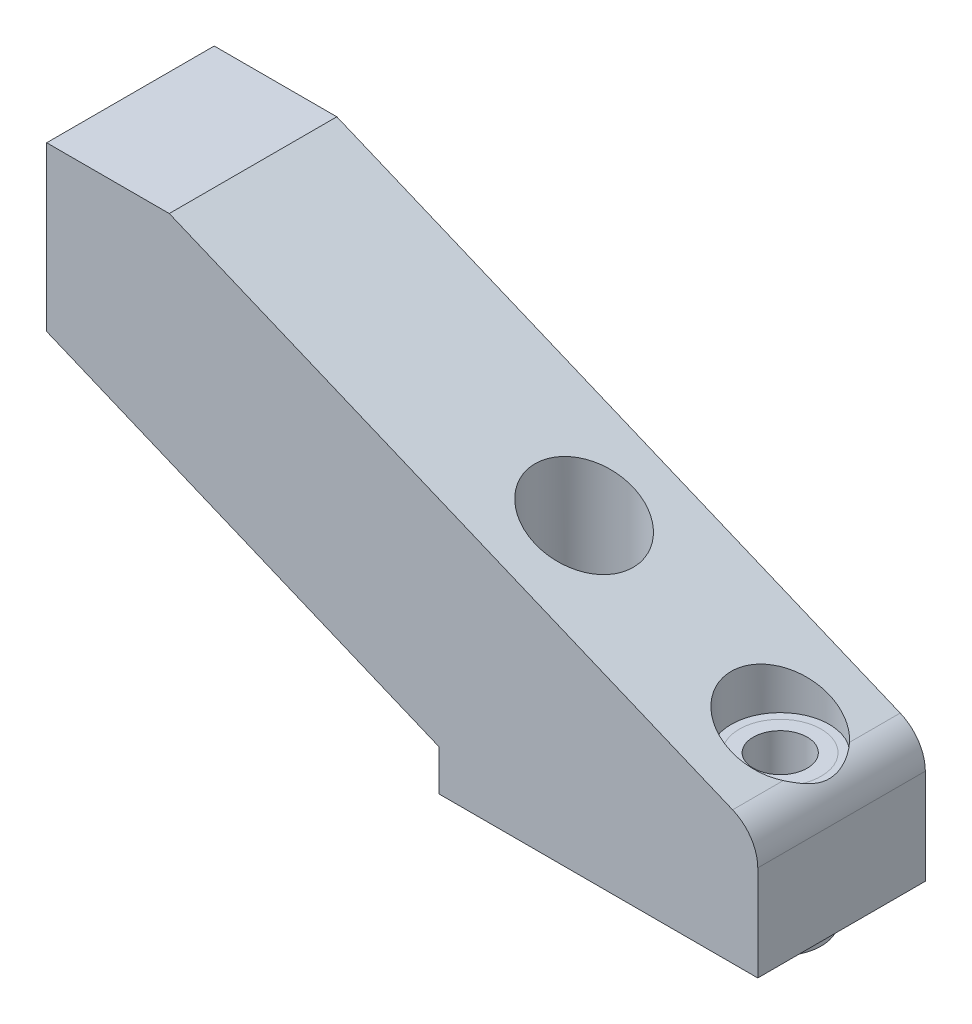
ISO-10303-21;
HEADER;
FILE_DESCRIPTION(('STEP AP214'),'2;1');
FILE_NAME('part.step','',(''),(''),'','','');
FILE_SCHEMA(('AUTOMOTIVE_DESIGN { 1 0 10303 214 1 1 1 1 }'));
ENDSEC;
DATA;
#1=APPLICATION_CONTEXT('core data for automotive mechanical design processes');
#2=APPLICATION_PROTOCOL_DEFINITION('international standard','automotive_design',2000,#1);
#3=PRODUCT_CONTEXT('',#1,'mechanical');
#4=PRODUCT('Part','Part','',(#3));
#5=PRODUCT_RELATED_PRODUCT_CATEGORY('part','',(#4));
#6=PRODUCT_DEFINITION_FORMATION('','',#4);
#7=PRODUCT_DEFINITION_CONTEXT('part definition',#1,'design');
#8=PRODUCT_DEFINITION('design','',#6,#7);
#9=PRODUCT_DEFINITION_SHAPE('','',#8);
#10=(LENGTH_UNIT() NAMED_UNIT(*) SI_UNIT(.MILLI.,.METRE.));
#11=(NAMED_UNIT(*) PLANE_ANGLE_UNIT() SI_UNIT($,.RADIAN.));
#12=(NAMED_UNIT(*) SI_UNIT($,.STERADIAN.) SOLID_ANGLE_UNIT());
#13=UNCERTAINTY_MEASURE_WITH_UNIT(LENGTH_MEASURE(1.E-05),#10,'distance_accuracy_value','');
#14=(GEOMETRIC_REPRESENTATION_CONTEXT(3) GLOBAL_UNCERTAINTY_ASSIGNED_CONTEXT((#13)) GLOBAL_UNIT_ASSIGNED_CONTEXT((#10,
#11,#12)) REPRESENTATION_CONTEXT('',''));
#15=CARTESIAN_POINT('',(0.,0.,0.));
#16=DIRECTION('',(0.,0.,1.));
#17=DIRECTION('',(1.,0.,0.));
#18=AXIS2_PLACEMENT_3D('',#15,#16,#17);
#19=CARTESIAN_POINT('',(-31.5,10.,10.25));
#20=DIRECTION('',(0.,1.,0.));
#21=DIRECTION('',(0.,0.,1.));
#22=AXIS2_PLACEMENT_3D('',#19,#20,#21);
#23=PLANE('',#22);
#24=CARTESIAN_POINT('',(-31.5,10.,10.25));
#25=DIRECTION('',(0.,1.,0.));
#26=DIRECTION('',(0.,0.,1.));
#27=AXIS2_PLACEMENT_3D('',#24,#25,#26);
#28=CIRCLE('',#27,6.);
#29=CARTESIAN_POINT('',(-31.5,10.,16.25));
#30=VERTEX_POINT('',#29);
#31=EDGE_CURVE('E277',#30,#30,#28,.T.);
#32=ORIENTED_EDGE('',*,*,#31,.T.);
#33=EDGE_LOOP('',(#32));
#34=FACE_BOUND('',#33,.T.);
#35=CARTESIAN_POINT('',(-31.5,10.,10.25));
#36=DIRECTION('',(0.,1.,0.));
#37=DIRECTION('',(0.,0.,1.));
#38=AXIS2_PLACEMENT_3D('',#35,#36,#37);
#39=CIRCLE('',#38,5.);
#40=CARTESIAN_POINT('',(-31.5,10.,15.25));
#41=VERTEX_POINT('',#40);
#42=EDGE_CURVE('E13',#41,#41,#39,.F.);
#43=ORIENTED_EDGE('',*,*,#42,.T.);
#44=EDGE_LOOP('',(#43));
#45=FACE_BOUND('',#44,.T.);
#46=ADVANCED_FACE('F54',(#34,#45),#23,.T.);
#47=CARTESIAN_POINT('',(-7.50000000000002,10.,10.25));
#48=DIRECTION('',(0.,1.,0.));
#49=DIRECTION('',(0.,0.,1.));
#50=AXIS2_PLACEMENT_3D('',#47,#48,#49);
#51=PLANE('',#50);
#52=CARTESIAN_POINT('',(-7.50000000000002,10.,10.25));
#53=DIRECTION('',(0.,1.,0.));
#54=DIRECTION('',(0.,0.,1.));
#55=AXIS2_PLACEMENT_3D('',#52,#53,#54);
#56=CIRCLE('',#55,6.);
#57=CARTESIAN_POINT('',(-7.50000000000002,10.,16.25));
#58=VERTEX_POINT('',#57);
#59=EDGE_CURVE('E204',#58,#58,#56,.T.);
#60=ORIENTED_EDGE('',*,*,#59,.T.);
#61=EDGE_LOOP('',(#60));
#62=FACE_BOUND('',#61,.T.);
#63=CARTESIAN_POINT('',(-7.5,10.,10.25));
#64=DIRECTION('',(0.,1.,0.));
#65=DIRECTION('',(0.,0.,1.));
#66=AXIS2_PLACEMENT_3D('',#63,#64,#65);
#67=CIRCLE('',#66,5.);
#68=CARTESIAN_POINT('',(-7.5,10.,15.25));
#69=VERTEX_POINT('',#68);
#70=EDGE_CURVE('E63',#69,#69,#67,.F.);
#71=ORIENTED_EDGE('',*,*,#70,.T.);
#72=EDGE_LOOP('',(#71));
#73=FACE_BOUND('',#72,.T.);
#74=ADVANCED_FACE('F222',(#62,#73),#51,.T.);
#75=CARTESIAN_POINT('',(-31.5,-10.,10.25));
#76=DIRECTION('',(0.,1.,0.));
#77=DIRECTION('',(0.,0.,1.));
#78=AXIS2_PLACEMENT_3D('',#75,#76,#77);
#79=CYLINDRICAL_SURFACE('',#78,3.3);
#80=CARTESIAN_POINT('',(-31.5,-5.,10.25));
#81=DIRECTION('',(0.,1.,0.));
#82=DIRECTION('',(0.,0.,1.));
#83=AXIS2_PLACEMENT_3D('',#80,#81,#82);
#84=CIRCLE('',#83,3.3);
#85=CARTESIAN_POINT('',(-31.5,-5.,13.55));
#86=VERTEX_POINT('',#85);
#87=EDGE_CURVE('E195',#86,#86,#84,.T.);
#88=ORIENTED_EDGE('',*,*,#87,.F.);
#89=EDGE_LOOP('',(#88));
#90=FACE_BOUND('',#89,.T.);
#91=CARTESIAN_POINT('',(-31.5,10.,10.25));
#92=DIRECTION('',(0.,1.,0.));
#93=DIRECTION('',(0.,0.,1.));
#94=AXIS2_PLACEMENT_3D('',#91,#92,#93);
#95=CIRCLE('',#94,3.3);
#96=CARTESIAN_POINT('',(-31.5,10.,13.55));
#97=VERTEX_POINT('',#96);
#98=EDGE_CURVE('E203',#97,#97,#95,.F.);
#99=ORIENTED_EDGE('',*,*,#98,.F.);
#100=EDGE_LOOP('',(#99));
#101=FACE_BOUND('',#100,.T.);
#102=ADVANCED_FACE('F234',(#90,#101),#79,.F.);
#103=CARTESIAN_POINT('',(-7.5,-10.,10.25));
#104=DIRECTION('',(0.,1.,0.));
#105=DIRECTION('',(0.,0.,1.));
#106=AXIS2_PLACEMENT_3D('',#103,#104,#105);
#107=CYLINDRICAL_SURFACE('',#106,3.3);
#108=CARTESIAN_POINT('',(-7.5,-5.,10.25));
#109=DIRECTION('',(0.,1.,0.));
#110=DIRECTION('',(0.,0.,1.));
#111=AXIS2_PLACEMENT_3D('',#108,#109,#110);
#112=CIRCLE('',#111,3.3);
#113=CARTESIAN_POINT('',(-7.5,-5.,13.55));
#114=VERTEX_POINT('',#113);
#115=EDGE_CURVE('E163',#114,#114,#112,.T.);
#116=ORIENTED_EDGE('',*,*,#115,.F.);
#117=EDGE_LOOP('',(#116));
#118=FACE_BOUND('',#117,.T.);
#119=CARTESIAN_POINT('',(-7.5,10.,10.25));
#120=DIRECTION('',(0.,1.,0.));
#121=DIRECTION('',(0.,0.,1.));
#122=AXIS2_PLACEMENT_3D('',#119,#120,#121);
#123=CIRCLE('',#122,3.3);
#124=CARTESIAN_POINT('',(-7.5,10.,13.55));
#125=VERTEX_POINT('',#124);
#126=EDGE_CURVE('E200',#125,#125,#123,.F.);
#127=ORIENTED_EDGE('',*,*,#126,.F.);
#128=EDGE_LOOP('',(#127));
#129=FACE_BOUND('',#128,.T.);
#130=ADVANCED_FACE('F232',(#118,#129),#107,.F.);
#131=CARTESIAN_POINT('',(0.,0.,20.5));
#132=DIRECTION('',(-1.,0.,0.));
#133=DIRECTION('',(0.,0.,1.));
#134=AXIS2_PLACEMENT_3D('',#131,#132,#133);
#135=PLANE('',#134);
#136=DIRECTION('',(0.,1.,0.));
#137=VECTOR('',#136,1.);
#138=CARTESIAN_POINT('',(0.,0.,0.));
#139=LINE('',#138,#137);
#140=CARTESIAN_POINT('',(0.,-5.,0.));
#141=VERTEX_POINT('',#140);
#142=CARTESIAN_POINT('',(0.,6.66666666666667,0.));
#143=VERTEX_POINT('',#142);
#144=EDGE_CURVE('E111',#141,#143,#139,.T.);
#145=ORIENTED_EDGE('',*,*,#144,.T.);
#146=DIRECTION('',(0.,0.,-1.));
#147=VECTOR('',#146,1.);
#148=CARTESIAN_POINT('',(0.,6.66666666666667,20.5));
#149=LINE('',#148,#147);
#150=CARTESIAN_POINT('',(0.,6.66666666666667,20.5));
#151=VERTEX_POINT('',#150);
#152=EDGE_CURVE('E191',#151,#143,#149,.T.);
#153=ORIENTED_EDGE('',*,*,#152,.F.);
#154=DIRECTION('',(0.,1.,0.));
#155=VECTOR('',#154,1.);
#156=CARTESIAN_POINT('',(0.,-5.,20.5));
#157=LINE('',#156,#155);
#158=CARTESIAN_POINT('',(0.,-5.,20.5));
#159=VERTEX_POINT('',#158);
#160=EDGE_CURVE('E117',#159,#151,#157,.T.);
#161=ORIENTED_EDGE('',*,*,#160,.F.);
#162=DIRECTION('',(0.,0.,-1.));
#163=VECTOR('',#162,1.);
#164=CARTESIAN_POINT('',(0.,-5.,20.5));
#165=LINE('',#164,#163);
#166=EDGE_CURVE('E157',#159,#141,#165,.T.);
#167=ORIENTED_EDGE('',*,*,#166,.T.);
#168=EDGE_LOOP('',(#145,#153,#161,#167));
#169=FACE_BOUND('',#168,.T.);
#170=ADVANCED_FACE('F56',(#169),#135,.F.);
#171=CARTESIAN_POINT('',(-5.,6.66666666666667,20.5));
#172=DIRECTION('',(0.,0.,-1.));
#173=DIRECTION('',(-1.,0.,0.));
#174=AXIS2_PLACEMENT_3D('',#171,#172,#173);
#175=CYLINDRICAL_SURFACE('',#174,5.);
#176=DIRECTION('',(0.,0.,-1.));
#177=VECTOR('',#176,1.);
#178=CARTESIAN_POINT('',(-3.07692307692308,11.2820512820513,20.5));
#179=LINE('',#178,#177);
#180=CARTESIAN_POINT('',(-3.07692307692308,11.2820512820513,6.19581814264034));
#181=VERTEX_POINT('',#180);
#182=CARTESIAN_POINT('',(-3.07692307692308,11.2820512820513,0.));
#183=VERTEX_POINT('',#182);
#184=EDGE_CURVE('E187',#181,#183,#179,.T.);
#185=ORIENTED_EDGE('',*,*,#184,.F.);
#186=CARTESIAN_POINT('',(-8.72677996249961,10.,4.37675465150574));
#187=CARTESIAN_POINT('',(-8.64534208200483,10.0910622314345,4.35974020699521));
#188=CARTESIAN_POINT('',(-8.56044065317051,10.1792570936248,4.34377802659103));
#189=CARTESIAN_POINT('',(-8.38407997862645,10.3494659563773,4.3148183609117));
#190=CARTESIAN_POINT('',(-8.29261654289261,10.4314759379331,4.30182279244698));
#191=CARTESIAN_POINT('',(-8.10318455108689,10.589101940094,4.27963117656772));
#192=CARTESIAN_POINT('',(-8.00518873346695,10.6646877270472,4.27045238037427));
#193=CARTESIAN_POINT('',(-7.80365031732199,10.8085097872096,4.25683784311139));
#194=CARTESIAN_POINT('',(-7.70010885445373,10.8767475566203,4.25240113481079));
#195=CARTESIAN_POINT('',(-7.48765142971187,11.0056876927195,4.24906785878474));
#196=CARTESIAN_POINT('',(-7.37871195621509,11.0663521308694,4.25019811299138));
#197=CARTESIAN_POINT('',(-7.15680441468711,11.1792812002115,4.2587946331975));
#198=CARTESIAN_POINT('',(-7.04383672236937,11.2315466122929,4.2662603097629));
#199=CARTESIAN_POINT('',(-6.81519530149293,11.3271795014355,4.28810483136917));
#200=CARTESIAN_POINT('',(-6.69952962823199,11.3705704280777,4.30246511283874));
#201=CARTESIAN_POINT('',(-6.4663490765512,11.4483947781114,4.33852990884014));
#202=CARTESIAN_POINT('',(-6.34883437977868,11.4828290756436,4.36023370619036));
#203=CARTESIAN_POINT('',(-6.12279476020176,11.5402486844358,4.40914666375533));
#204=CARTESIAN_POINT('',(-6.01431930944292,11.5639392696264,4.43576157423551));
#205=CARTESIAN_POINT('',(-5.79773126930068,11.6038474141021,4.49544512274686));
#206=CARTESIAN_POINT('',(-5.68961880947288,11.6200625392498,4.5285158579224));
#207=CARTESIAN_POINT('',(-5.47465287224055,11.6452631165173,4.60103172043856));
#208=CARTESIAN_POINT('',(-5.36779994180698,11.6542455339974,4.64047951508665));
#209=CARTESIAN_POINT('',(-5.15617845757796,11.6653506959972,4.72555305927101));
#210=CARTESIAN_POINT('',(-5.05141075709718,11.667470687402,4.77118128066676));
#211=CARTESIAN_POINT('',(-4.8454332735961,11.66533060126,4.8679808216041));
#212=CARTESIAN_POINT('',(-4.74420375747059,11.6611149629025,4.91911121795795));
#213=CARTESIAN_POINT('',(-4.54510560431886,11.6469323425467,5.02683683751179));
#214=CARTESIAN_POINT('',(-4.44723802811781,11.6369635625491,5.08343376453167));
#215=CARTESIAN_POINT('',(-4.15942323709116,11.5992935137595,5.26088780372263));
#216=CARTESIAN_POINT('',(-3.9751345801595,11.5638257961835,5.38946923531912));
#217=CARTESIAN_POINT('',(-3.67271690195939,11.4890656838207,5.6263557386551));
#218=CARTESIAN_POINT('',(-3.55031600392748,11.4534974913457,5.73053408188319));
#219=CARTESIAN_POINT('',(-3.31529887985958,11.3759208216473,5.94723384358054));
#220=CARTESIAN_POINT('',(-3.20268336875502,11.333911874474,6.0597558705375));
#221=CARTESIAN_POINT('',(-2.98729291505787,11.2451620691773,6.29263820038802));
#222=CARTESIAN_POINT('',(-2.8845435668895,11.1984095182233,6.4130175977789));
#223=CARTESIAN_POINT('',(-2.68938591877344,11.1020805443862,6.66073202517334));
#224=CARTESIAN_POINT('',(-2.59697402864899,11.052505110967,6.78806461734076));
#225=CARTESIAN_POINT('',(-2.42086438929259,10.951357031881,7.05187082885497));
#226=CARTESIAN_POINT('',(-2.337373952219,10.8997642816631,7.18847503626284));
#227=CARTESIAN_POINT('',(-2.18141444607274,10.7975584933672,7.46822081618814));
#228=CARTESIAN_POINT('',(-2.10894686410207,10.7469455882834,7.61136326740391));
#229=CARTESIAN_POINT('',(-1.97546353568661,10.6490051675813,7.90366895436532));
#230=CARTESIAN_POINT('',(-1.91442858221183,10.6016722274259,8.05282157109221));
#231=CARTESIAN_POINT('',(-1.80411282261906,10.5126172118048,8.35710606237861));
#232=CARTESIAN_POINT('',(-1.7548331317351,10.4708956688619,8.51223850262976));
#233=CARTESIAN_POINT('',(-1.67880979591923,10.4045284884872,8.7907531377097));
#234=CARTESIAN_POINT('',(-1.64949168330156,10.3781742154156,8.91302734109111));
#235=CARTESIAN_POINT('',(-1.59844989111952,10.3314527008079,9.16022117274573));
#236=CARTESIAN_POINT('',(-1.57672157947953,10.3110818088107,9.2851391379733));
#237=CARTESIAN_POINT('',(-1.54118383330588,10.2773720666038,9.53681786946379));
#238=CARTESIAN_POINT('',(-1.5273602644863,10.264020668469,9.66357492835813));
#239=CARTESIAN_POINT('',(-1.50781458638908,10.2450503033721,9.91829700264618));
#240=CARTESIAN_POINT('',(-1.50209233598923,10.239431201716,10.046261996959));
#241=CARTESIAN_POINT('',(-1.49885729429702,10.2362612605154,10.3027732484166));
#242=CARTESIAN_POINT('',(-1.50136857369596,10.2387340776226,10.4313201107506));
#243=CARTESIAN_POINT('',(-1.5146018433274,10.2516468875179,10.6875780670445));
#244=CARTESIAN_POINT('',(-1.52532390534227,10.2620869499593,10.8152891536878));
#245=CARTESIAN_POINT('',(-1.5548061506279,10.2903460463166,11.069160394439));
#246=CARTESIAN_POINT('',(-1.57357937890581,10.3081770539305,11.1953176882503));
#247=CARTESIAN_POINT('',(-1.61886791807501,10.3502655759044,11.445172722967));
#248=CARTESIAN_POINT('',(-1.64538808088196,10.3745271168312,11.5688688704373));
#249=CARTESIAN_POINT('',(-1.75416868252659,10.471348662546,12.0084671749908));
#250=CARTESIAN_POINT('',(-1.85783734886878,10.5591929550256,12.3160446216262));
#251=CARTESIAN_POINT('',(-2.04718308141948,10.7024052653886,12.7585322279136));
#252=CARTESIAN_POINT('',(-2.11606817124928,10.7521339169147,12.9030850813188));
#253=CARTESIAN_POINT('',(-2.26490484059295,10.853232764608,13.1858563064587));
#254=CARTESIAN_POINT('',(-2.34485529409114,10.9046027933396,13.3240753208247));
#255=CARTESIAN_POINT('',(-2.51792889855564,11.0083005529025,13.5975191887942));
#256=CARTESIAN_POINT('',(-2.61135387263293,11.0606157641962,13.7325571308169));
#257=CARTESIAN_POINT('',(-2.8094988738899,11.1626787857137,13.9951629726261));
#258=CARTESIAN_POINT('',(-2.9142201979631,11.212426300178,14.1227300121055));
#259=CARTESIAN_POINT('',(-3.13453575183232,11.3071832380803,14.3694680640624));
#260=CARTESIAN_POINT('',(-3.25010532815848,11.3522029347097,14.4886570866803));
#261=CARTESIAN_POINT('',(-3.49205880459036,11.4355740873376,14.7181303111237));
#262=CARTESIAN_POINT('',(-3.61844242464034,11.4739257159439,14.8284147434113));
#263=CARTESIAN_POINT('',(-3.84757497540289,11.5330911683336,15.0118735232858));
#264=CARTESIAN_POINT('',(-3.94802693658163,11.5558778703609,15.0872898034483));
#265=CARTESIAN_POINT('',(-4.15422961232645,11.5957327964458,15.2321366200773));
#266=CARTESIAN_POINT('',(-4.25997901103005,11.6128024325825,15.301568631469));
#267=CARTESIAN_POINT('',(-4.47629770447335,11.6403597032782,15.4339465297516));
#268=CARTESIAN_POINT('',(-4.58686684573356,11.6508475472639,15.4968926229652));
#269=CARTESIAN_POINT('',(-4.8121124386083,11.6644081512859,15.6157680683279));
#270=CARTESIAN_POINT('',(-4.92678714357377,11.6674840274649,15.6717003598437));
#271=CARTESIAN_POINT('',(-5.16039133990522,11.6654693382084,15.7765499940617));
#272=CARTESIAN_POINT('',(-5.27934823219195,11.6603108278583,15.8254053063436));
#273=CARTESIAN_POINT('',(-5.5195288192643,11.6410612020782,15.9151714569376));
#274=CARTESIAN_POINT('',(-5.64075251918756,11.6269700664002,15.9560822772413));
#275=CARTESIAN_POINT('',(-5.88410565671303,11.5894198568775,16.0297084799398));
#276=CARTESIAN_POINT('',(-6.0062340770016,11.565970086041,16.0624319486226));
#277=CARTESIAN_POINT('',(-6.25017559080543,11.509468533753,16.1197216238231));
#278=CARTESIAN_POINT('',(-6.37198871738301,11.4764178039499,16.1442887231238));
#279=CARTESIAN_POINT('',(-6.59934236616271,11.4052883476641,16.1829983367237));
#280=CARTESIAN_POINT('',(-6.7050729126935,11.3682974504992,16.1980410030959));
#281=CARTESIAN_POINT('',(-6.91441453857081,11.287015854394,16.2222855487862));
#282=CARTESIAN_POINT('',(-7.01802493138596,11.2427228317055,16.2314855642664));
#283=CARTESIAN_POINT('',(-7.22240793993966,11.147029721617,16.2444510504448));
#284=CARTESIAN_POINT('',(-7.32317690734384,11.095620957012,16.2482098207644));
#285=CARTESIAN_POINT('',(-7.5210796515921,10.9860366955517,16.2507794693402));
#286=CARTESIAN_POINT('',(-7.61821183866396,10.9278582840437,16.2495882086555));
#287=CARTESIAN_POINT('',(-7.80739690431406,10.8056399664946,16.2428618246198));
#288=CARTESIAN_POINT('',(-7.8994854733435,10.7416531601906,16.237363119379));
#289=CARTESIAN_POINT('',(-8.0789740278395,10.60779032665,16.2226793974975));
#290=CARTESIAN_POINT('',(-8.16637356166168,10.537913733774,16.2134940264801));
#291=CARTESIAN_POINT('',(-8.33576762616309,10.3929297277908,16.1921169175614));
#292=CARTESIAN_POINT('',(-8.41778054998475,10.3178421327105,16.1799361652748));
#293=CARTESIAN_POINT('',(-8.57639971848202,10.1626194604887,16.1532056430673));
#294=CARTESIAN_POINT('',(-8.65300840759252,10.0824866968154,16.1386569541847));
#295=CARTESIAN_POINT('',(-8.72677996249961,10.,16.1232453484943));
#296=B_SPLINE_CURVE_WITH_KNOTS('',3,(#186,#187,#188,#189,#190,#191,#192,#193,#194,#195,#196,
#197,#198,#199,#200,#201,#202,#203,#204,#205,#206,#207,#208,#209,#210,#211,#212,#213,#214,#215,
#216,#217,#218,#219,#220,#221,#222,#223,#224,#225,#226,#227,#228,#229,#230,#231,#232,#233,#234,
#235,#236,#237,#238,#239,#240,#241,#242,#243,#244,#245,#246,#247,#248,#249,#250,#251,#252,#253,
#254,#255,#256,#257,#258,#259,#260,#261,#262,#263,#264,#265,#266,#267,#268,#269,#270,#271,#272,
#273,#274,#275,#276,#277,#278,#279,#280,#281,#282,#283,#284,#285,#286,#287,#288,#289,#290,#291,
#292,#293,#294,#295),.UNSPECIFIED.,.F.,.F.,(4,2,2,2,2,2,2,2,2,2,2,2,2,2,2,2,2,2,2,2,2,2,2,2,2,2,
2,2,2,2,2,2,2,2,2,2,2,2,2,2,2,2,2,2,2,2,2,2,2,2,2,2,2,2,4),(0.,0.36998647747597,
0.740211341093072,1.11209183776203,1.48389646846271,1.8574942216845,2.2310572199843,
2.60362000114104,2.9761464076111,3.31825423564529,3.66047338129057,4.00283603770738,
4.34533602849574,4.68544485187054,5.02566002528002,5.70566522417399,6.19895567273322,
6.69228213139916,7.18685561346553,7.68125679443608,8.18538885211555,8.68958886243598,
9.1929340571203,9.69632698571321,10.0813967753811,10.4662311436374,10.8503752293901,
11.2345126234013,11.6197740417826,12.0050388283317,12.3909302176407,12.7770638113357,
13.7794755687372,14.2821980735743,14.7848694587366,15.3013663956225,15.8179226929114,
16.3333322575188,16.8487284783901,17.2313743952762,17.6139257312307,17.9964648941381,
18.3788432016775,18.7643929947688,19.149943661803,19.5351120206828,19.9202382057485,
20.2588959213398,20.5976616164149,20.936844115582,21.2761731929809,21.6126639115255,
21.9491869826322,22.2844937898427,22.619647946014),.UNSPECIFIED.);
#297=CARTESIAN_POINT('',(-3.07692307692308,11.2820512820513,14.3041818573597));
#298=VERTEX_POINT('',#297);
#299=EDGE_CURVE('E69',#181,#298,#296,.T.);
#300=ORIENTED_EDGE('',*,*,#299,.T.);
#301=CARTESIAN_POINT('',(-3.07692307692308,11.2820512820513,20.5));
#302=VERTEX_POINT('',#301);
#303=EDGE_CURVE('E188',#302,#298,#179,.T.);
#304=ORIENTED_EDGE('',*,*,#303,.F.);
#305=CARTESIAN_POINT('',(-5.,6.66666666666667,20.5));
#306=DIRECTION('',(0.,0.,1.));
#307=DIRECTION('',(1.,0.,0.));
#308=AXIS2_PLACEMENT_3D('',#305,#306,#307);
#309=CIRCLE('',#308,5.);
#310=EDGE_CURVE('E292',#151,#302,#309,.T.);
#311=ORIENTED_EDGE('',*,*,#310,.F.);
#312=ORIENTED_EDGE('',*,*,#152,.T.);
#313=CARTESIAN_POINT('',(-5.,6.66666666666667,0.));
#314=DIRECTION('',(0.,0.,1.));
#315=DIRECTION('',(1.,0.,0.));
#316=AXIS2_PLACEMENT_3D('',#313,#314,#315);
#317=CIRCLE('',#316,5.);
#318=EDGE_CURVE('E162',#143,#183,#317,.T.);
#319=ORIENTED_EDGE('',*,*,#318,.T.);
#320=EDGE_LOOP('',(#185,#300,#304,#311,#312,#319));
#321=FACE_BOUND('',#320,.T.);
#322=ADVANCED_FACE('F241',(#321),#175,.T.);
#323=CARTESIAN_POINT('',(-3.07692307692308,11.2820512820513,20.5));
#324=DIRECTION('',(-0.384615384615385,-0.923076923076923,0.));
#325=DIRECTION('',(0.923076923076923,-0.384615384615385,0.));
#326=AXIS2_PLACEMENT_3D('',#323,#324,#325);
#327=PLANE('',#326);
#328=CARTESIAN_POINT('',(-31.5,23.125,10.25));
#329=DIRECTION('',(-0.384615384615385,-0.923076923076923,0.));
#330=DIRECTION('',(-0.923076923076923,0.384615384615385,0.));
#331=AXIS2_PLACEMENT_3D('',#328,#329,#330);
#332=ELLIPSE('',#331,6.5,6.);
#333=CARTESIAN_POINT('',(-37.5,25.625,10.25));
#334=VERTEX_POINT('',#333);
#335=EDGE_CURVE('E207',#334,#334,#332,.T.);
#336=ORIENTED_EDGE('',*,*,#335,.T.);
#337=EDGE_LOOP('',(#336));
#338=FACE_BOUND('',#337,.T.);
#339=ORIENTED_EDGE('',*,*,#303,.T.);
#340=CARTESIAN_POINT('',(-7.50000000000002,13.125,10.25));
#341=DIRECTION('',(-0.384615384615385,-0.923076923076923,0.));
#342=DIRECTION('',(-0.923076923076923,0.384615384615385,0.));
#343=AXIS2_PLACEMENT_3D('',#340,#341,#342);
#344=ELLIPSE('',#343,6.5,6.);
#345=EDGE_CURVE('E194',#298,#181,#344,.T.);
#346=ORIENTED_EDGE('',*,*,#345,.T.);
#347=ORIENTED_EDGE('',*,*,#184,.T.);
#348=DIRECTION('',(-0.923076923076923,0.384615384615385,0.));
#349=VECTOR('',#348,1.);
#350=CARTESIAN_POINT('',(-3.07692307692308,11.2820512820513,0.));
#351=LINE('',#350,#349);
#352=CARTESIAN_POINT('',(-72.,40.,0.));
#353=VERTEX_POINT('',#352);
#354=EDGE_CURVE('E166',#183,#353,#351,.T.);
#355=ORIENTED_EDGE('',*,*,#354,.T.);
#356=DIRECTION('',(0.,0.,-1.));
#357=VECTOR('',#356,1.);
#358=CARTESIAN_POINT('',(-72.,40.,20.5));
#359=LINE('',#358,#357);
#360=CARTESIAN_POINT('',(-72.,40.,20.5));
#361=VERTEX_POINT('',#360);
#362=EDGE_CURVE('E184',#361,#353,#359,.T.);
#363=ORIENTED_EDGE('',*,*,#362,.F.);
#364=DIRECTION('',(-0.923076923076923,0.384615384615385,0.));
#365=VECTOR('',#364,1.);
#366=CARTESIAN_POINT('',(-3.07692307692308,11.2820512820513,20.5));
#367=LINE('',#366,#365);
#368=EDGE_CURVE('E289',#302,#361,#367,.T.);
#369=ORIENTED_EDGE('',*,*,#368,.F.);
#370=EDGE_LOOP('',(#339,#346,#347,#355,#363,#369));
#371=FACE_BOUND('',#370,.T.);
#372=ADVANCED_FACE('F280',(#338,#371),#327,.F.);
#373=CARTESIAN_POINT('',(-72.,40.,20.5));
#374=DIRECTION('',(0.,-1.,0.));
#375=DIRECTION('',(1.,0.,0.));
#376=AXIS2_PLACEMENT_3D('',#373,#374,#375);
#377=PLANE('',#376);
#378=DIRECTION('',(-1.,0.,0.));
#379=VECTOR('',#378,1.);
#380=CARTESIAN_POINT('',(-72.,40.,0.));
#381=LINE('',#380,#379);
#382=CARTESIAN_POINT('',(-87.,40.,0.));
#383=VERTEX_POINT('',#382);
#384=EDGE_CURVE('E168',#353,#383,#381,.T.);
#385=ORIENTED_EDGE('',*,*,#384,.T.);
#386=DIRECTION('',(0.,0.,-1.));
#387=VECTOR('',#386,1.);
#388=CARTESIAN_POINT('',(-87.,40.,20.5));
#389=LINE('',#388,#387);
#390=CARTESIAN_POINT('',(-87.,40.,20.5));
#391=VERTEX_POINT('',#390);
#392=EDGE_CURVE('E181',#391,#383,#389,.T.);
#393=ORIENTED_EDGE('',*,*,#392,.F.);
#394=DIRECTION('',(-1.,0.,0.));
#395=VECTOR('',#394,1.);
#396=CARTESIAN_POINT('',(-72.,40.,20.5));
#397=LINE('',#396,#395);
#398=EDGE_CURVE('E369',#361,#391,#397,.T.);
#399=ORIENTED_EDGE('',*,*,#398,.F.);
#400=ORIENTED_EDGE('',*,*,#362,.T.);
#401=EDGE_LOOP('',(#385,#393,#399,#400));
#402=FACE_BOUND('',#401,.T.);
#403=ADVANCED_FACE('F283',(#402),#377,.F.);
#404=CARTESIAN_POINT('',(-87.,40.,20.5));
#405=DIRECTION('',(1.,0.,0.));
#406=DIRECTION('',(0.,0.,-1.));
#407=AXIS2_PLACEMENT_3D('',#404,#405,#406);
#408=PLANE('',#407);
#409=DIRECTION('',(0.,-1.,0.));
#410=VECTOR('',#409,1.);
#411=CARTESIAN_POINT('',(-87.,40.,0.));
#412=LINE('',#411,#410);
#413=CARTESIAN_POINT('',(-87.,20.,0.));
#414=VERTEX_POINT('',#413);
#415=EDGE_CURVE('E170',#383,#414,#412,.T.);
#416=ORIENTED_EDGE('',*,*,#415,.T.);
#417=DIRECTION('',(0.,0.,-1.));
#418=VECTOR('',#417,1.);
#419=CARTESIAN_POINT('',(-87.,20.,20.5));
#420=LINE('',#419,#418);
#421=CARTESIAN_POINT('',(-87.,20.,20.5));
#422=VERTEX_POINT('',#421);
#423=EDGE_CURVE('E151',#422,#414,#420,.T.);
#424=ORIENTED_EDGE('',*,*,#423,.F.);
#425=DIRECTION('',(0.,-1.,0.));
#426=VECTOR('',#425,1.);
#427=CARTESIAN_POINT('',(-87.,40.,20.5));
#428=LINE('',#427,#426);
#429=EDGE_CURVE('E139',#391,#422,#428,.T.);
#430=ORIENTED_EDGE('',*,*,#429,.F.);
#431=ORIENTED_EDGE('',*,*,#392,.T.);
#432=EDGE_LOOP('',(#416,#424,#430,#431));
#433=FACE_BOUND('',#432,.T.);
#434=ADVANCED_FACE('F378',(#433),#408,.F.);
#435=CARTESIAN_POINT('',(-87.,20.,20.5));
#436=DIRECTION('',(0.384615384615385,0.923076923076923,0.));
#437=DIRECTION('',(-0.923076923076923,0.384615384615385,0.));
#438=AXIS2_PLACEMENT_3D('',#435,#436,#437);
#439=PLANE('',#438);
#440=DIRECTION('',(0.923076923076923,-0.384615384615385,0.));
#441=VECTOR('',#440,1.);
#442=CARTESIAN_POINT('',(-87.,20.,0.));
#443=LINE('',#442,#441);
#444=CARTESIAN_POINT('',(-39.,0.,0.));
#445=VERTEX_POINT('',#444);
#446=EDGE_CURVE('E148',#414,#445,#443,.T.);
#447=ORIENTED_EDGE('',*,*,#446,.T.);
#448=DIRECTION('',(0.,0.,-1.));
#449=VECTOR('',#448,1.);
#450=CARTESIAN_POINT('',(-39.,0.,20.5));
#451=LINE('',#450,#449);
#452=CARTESIAN_POINT('',(-39.,0.,20.5));
#453=VERTEX_POINT('',#452);
#454=EDGE_CURVE('E145',#453,#445,#451,.T.);
#455=ORIENTED_EDGE('',*,*,#454,.F.);
#456=DIRECTION('',(0.923076923076923,-0.384615384615385,0.));
#457=VECTOR('',#456,1.);
#458=CARTESIAN_POINT('',(-87.,20.,20.5));
#459=LINE('',#458,#457);
#460=EDGE_CURVE('E132',#422,#453,#459,.T.);
#461=ORIENTED_EDGE('',*,*,#460,.F.);
#462=ORIENTED_EDGE('',*,*,#423,.T.);
#463=EDGE_LOOP('',(#447,#455,#461,#462));
#464=FACE_BOUND('',#463,.T.);
#465=ADVANCED_FACE('F146',(#464),#439,.F.);
#466=CARTESIAN_POINT('',(-39.,0.,20.5));
#467=DIRECTION('',(1.,0.,0.));
#468=DIRECTION('',(0.,1.,0.));
#469=AXIS2_PLACEMENT_3D('',#466,#467,#468);
#470=PLANE('',#469);
#471=DIRECTION('',(0.,-1.,0.));
#472=VECTOR('',#471,1.);
#473=CARTESIAN_POINT('',(-39.,0.,0.));
#474=LINE('',#473,#472);
#475=CARTESIAN_POINT('',(-39.,-5.,0.));
#476=VERTEX_POINT('',#475);
#477=EDGE_CURVE('E173',#445,#476,#474,.T.);
#478=ORIENTED_EDGE('',*,*,#477,.T.);
#479=DIRECTION('',(0.,0.,-1.));
#480=VECTOR('',#479,1.);
#481=CARTESIAN_POINT('',(-39.,-5.,20.5));
#482=LINE('',#481,#480);
#483=CARTESIAN_POINT('',(-39.,-5.,20.5));
#484=VERTEX_POINT('',#483);
#485=EDGE_CURVE('E152',#484,#476,#482,.T.);
#486=ORIENTED_EDGE('',*,*,#485,.F.);
#487=DIRECTION('',(0.,-1.,0.));
#488=VECTOR('',#487,1.);
#489=CARTESIAN_POINT('',(-39.,0.,20.5));
#490=LINE('',#489,#488);
#491=EDGE_CURVE('E136',#453,#484,#490,.T.);
#492=ORIENTED_EDGE('',*,*,#491,.F.);
#493=ORIENTED_EDGE('',*,*,#454,.T.);
#494=EDGE_LOOP('',(#478,#486,#492,#493));
#495=FACE_BOUND('',#494,.T.);
#496=ADVANCED_FACE('F154',(#495),#470,.F.);
#497=CARTESIAN_POINT('',(-39.,-5.,20.5));
#498=DIRECTION('',(0.,1.,0.));
#499=DIRECTION('',(0.,0.,1.));
#500=AXIS2_PLACEMENT_3D('',#497,#498,#499);
#501=PLANE('',#500);
#502=CARTESIAN_POINT('',(-7.5,-5.,10.25));
#503=DIRECTION('',(0.,1.,0.));
#504=DIRECTION('',(0.,0.,1.));
#505=AXIS2_PLACEMENT_3D('',#502,#503,#504);
#506=CIRCLE('',#505,5.);
#507=CARTESIAN_POINT('',(-7.5,-5.,15.25));
#508=VERTEX_POINT('',#507);
#509=EDGE_CURVE('E214',#508,#508,#506,.F.);
#510=ORIENTED_EDGE('',*,*,#509,.F.);
#511=EDGE_LOOP('',(#510));
#512=FACE_BOUND('',#511,.T.);
#513=CARTESIAN_POINT('',(-31.5,-5.,10.25));
#514=DIRECTION('',(0.,1.,0.));
#515=DIRECTION('',(0.,0.,1.));
#516=AXIS2_PLACEMENT_3D('',#513,#514,#515);
#517=CIRCLE('',#516,5.);
#518=CARTESIAN_POINT('',(-31.5,-5.,15.25));
#519=VERTEX_POINT('',#518);
#520=EDGE_CURVE('E211',#519,#519,#517,.F.);
#521=ORIENTED_EDGE('',*,*,#520,.F.);
#522=EDGE_LOOP('',(#521));
#523=FACE_BOUND('',#522,.T.);
#524=DIRECTION('',(1.,0.,0.));
#525=VECTOR('',#524,1.);
#526=CARTESIAN_POINT('',(-39.,-5.,0.));
#527=LINE('',#526,#525);
#528=EDGE_CURVE('E175',#476,#141,#527,.T.);
#529=ORIENTED_EDGE('',*,*,#528,.T.);
#530=ORIENTED_EDGE('',*,*,#166,.F.);
#531=DIRECTION('',(1.,0.,0.));
#532=VECTOR('',#531,1.);
#533=CARTESIAN_POINT('',(-39.,-5.,20.5));
#534=LINE('',#533,#532);
#535=EDGE_CURVE('E78',#484,#159,#534,.T.);
#536=ORIENTED_EDGE('',*,*,#535,.F.);
#537=ORIENTED_EDGE('',*,*,#485,.T.);
#538=EDGE_LOOP('',(#529,#530,#536,#537));
#539=FACE_BOUND('',#538,.T.);
#540=ADVANCED_FACE('F364',(#512,#523,#539),#501,.F.);
#541=CARTESIAN_POINT('',(-5.,6.66666666666667,20.5));
#542=DIRECTION('',(0.,0.,1.));
#543=DIRECTION('',(1.,0.,0.));
#544=AXIS2_PLACEMENT_3D('',#541,#542,#543);
#545=PLANE('',#544);
#546=ORIENTED_EDGE('',*,*,#160,.T.);
#547=ORIENTED_EDGE('',*,*,#310,.T.);
#548=ORIENTED_EDGE('',*,*,#368,.T.);
#549=ORIENTED_EDGE('',*,*,#398,.T.);
#550=ORIENTED_EDGE('',*,*,#429,.T.);
#551=ORIENTED_EDGE('',*,*,#460,.T.);
#552=ORIENTED_EDGE('',*,*,#491,.T.);
#553=ORIENTED_EDGE('',*,*,#535,.T.);
#554=EDGE_LOOP('',(#546,#547,#548,#549,#550,#551,#552,#553));
#555=FACE_BOUND('',#554,.T.);
#556=ADVANCED_FACE('F134',(#555),#545,.T.);
#557=CARTESIAN_POINT('',(-5.,6.66666666666667,0.));
#558=DIRECTION('',(0.,0.,1.));
#559=DIRECTION('',(1.,0.,0.));
#560=AXIS2_PLACEMENT_3D('',#557,#558,#559);
#561=PLANE('',#560);
#562=ORIENTED_EDGE('',*,*,#144,.F.);
#563=ORIENTED_EDGE('',*,*,#528,.F.);
#564=ORIENTED_EDGE('',*,*,#477,.F.);
#565=ORIENTED_EDGE('',*,*,#446,.F.);
#566=ORIENTED_EDGE('',*,*,#415,.F.);
#567=ORIENTED_EDGE('',*,*,#384,.F.);
#568=ORIENTED_EDGE('',*,*,#354,.F.);
#569=ORIENTED_EDGE('',*,*,#318,.F.);
#570=EDGE_LOOP('',(#562,#563,#564,#565,#566,#567,#568,#569));
#571=FACE_BOUND('',#570,.T.);
#572=ADVANCED_FACE('F305',(#571),#561,.F.);
#573=CARTESIAN_POINT('',(-7.50000000000002,10.,10.25));
#574=DIRECTION('',(0.,1.,0.));
#575=DIRECTION('',(0.,0.,1.));
#576=AXIS2_PLACEMENT_3D('',#573,#574,#575);
#577=CYLINDRICAL_SURFACE('',#576,6.);
#578=ORIENTED_EDGE('',*,*,#59,.F.);
#579=EDGE_LOOP('',(#578));
#580=FACE_BOUND('',#579,.T.);
#581=ORIENTED_EDGE('',*,*,#345,.F.);
#582=ORIENTED_EDGE('',*,*,#299,.F.);
#583=EDGE_LOOP('',(#581,#582));
#584=FACE_BOUND('',#583,.T.);
#585=ADVANCED_FACE('F228',(#580,#584),#577,.F.);
#586=ORIENTED_EDGE('',*,*,#70,.F.);
#587=EDGE_LOOP('',(#586));
#588=FACE_BOUND('',#587,.T.);
#589=ORIENTED_EDGE('',*,*,#126,.T.);
#590=EDGE_LOOP('',(#589));
#591=FACE_BOUND('',#590,.T.);
#592=ADVANCED_FACE('F224',(#588,#591),#51,.T.);
#593=CARTESIAN_POINT('',(-31.5,10.,10.25));
#594=DIRECTION('',(0.,1.,0.));
#595=DIRECTION('',(0.,0.,1.));
#596=AXIS2_PLACEMENT_3D('',#593,#594,#595);
#597=CYLINDRICAL_SURFACE('',#596,6.);
#598=ORIENTED_EDGE('',*,*,#31,.F.);
#599=EDGE_LOOP('',(#598));
#600=FACE_BOUND('',#599,.T.);
#601=ORIENTED_EDGE('',*,*,#335,.F.);
#602=EDGE_LOOP('',(#601));
#603=FACE_BOUND('',#602,.T.);
#604=ADVANCED_FACE('F227',(#600,#603),#597,.F.);
#605=ORIENTED_EDGE('',*,*,#42,.F.);
#606=EDGE_LOOP('',(#605));
#607=FACE_BOUND('',#606,.T.);
#608=ORIENTED_EDGE('',*,*,#98,.T.);
#609=EDGE_LOOP('',(#608));
#610=FACE_BOUND('',#609,.T.);
#611=ADVANCED_FACE('F250',(#607,#610),#23,.T.);
#612=CARTESIAN_POINT('',(-31.5,-5.,10.25));
#613=DIRECTION('',(0.,-1.,0.));
#614=DIRECTION('',(0.,0.,-1.));
#615=AXIS2_PLACEMENT_3D('',#612,#613,#614);
#616=PLANE('',#615);
#617=CARTESIAN_POINT('',(-31.5,-5.,10.25));
#618=DIRECTION('',(0.,-1.,0.));
#619=DIRECTION('',(0.,0.,-1.));
#620=AXIS2_PLACEMENT_3D('',#617,#618,#619);
#621=CIRCLE('',#620,3.25);
#622=CARTESIAN_POINT('',(-31.5,-5.,7.00000000000001));
#623=VERTEX_POINT('',#622);
#624=EDGE_CURVE('E349',#623,#623,#621,.T.);
#625=ORIENTED_EDGE('',*,*,#624,.T.);
#626=EDGE_LOOP('',(#625));
#627=FACE_BOUND('',#626,.T.);
#628=ORIENTED_EDGE('',*,*,#87,.T.);
#629=EDGE_LOOP('',(#628));
#630=FACE_BOUND('',#629,.T.);
#631=ADVANCED_FACE('F259',(#627,#630),#616,.F.);
#632=CARTESIAN_POINT('',(-31.5,-8.,10.25));
#633=DIRECTION('',(0.,-1.,0.));
#634=DIRECTION('',(0.,0.,-1.));
#635=AXIS2_PLACEMENT_3D('',#632,#633,#634);
#636=PLANE('',#635);
#637=CARTESIAN_POINT('',(-31.5,-8.,10.25));
#638=DIRECTION('',(0.,-1.,0.));
#639=DIRECTION('',(0.,0.,-1.));
#640=AXIS2_PLACEMENT_3D('',#637,#638,#639);
#641=CIRCLE('',#640,5.);
#642=CARTESIAN_POINT('',(-31.5,-8.,5.25));
#643=VERTEX_POINT('',#642);
#644=EDGE_CURVE('E353',#643,#643,#641,.T.);
#645=ORIENTED_EDGE('',*,*,#644,.T.);
#646=EDGE_LOOP('',(#645));
#647=FACE_BOUND('',#646,.T.);
#648=CARTESIAN_POINT('',(-31.5,-8.,10.25));
#649=DIRECTION('',(0.,-1.,0.));
#650=DIRECTION('',(0.,0.,-1.));
#651=AXIS2_PLACEMENT_3D('',#648,#649,#650);
#652=CIRCLE('',#651,3.25);
#653=CARTESIAN_POINT('',(-31.5,-8.,7.00000000000001));
#654=VERTEX_POINT('',#653);
#655=EDGE_CURVE('E350',#654,#654,#652,.T.);
#656=ORIENTED_EDGE('',*,*,#655,.F.);
#657=EDGE_LOOP('',(#656));
#658=FACE_BOUND('',#657,.T.);
#659=ADVANCED_FACE('F265',(#647,#658),#636,.T.);
#660=CARTESIAN_POINT('',(-31.5,-8.,10.25));
#661=DIRECTION('',(0.,1.,0.));
#662=DIRECTION('',(0.,0.,1.));
#663=AXIS2_PLACEMENT_3D('',#660,#661,#662);
#664=CYLINDRICAL_SURFACE('',#663,5.);
#665=ORIENTED_EDGE('',*,*,#644,.F.);
#666=EDGE_LOOP('',(#665));
#667=FACE_BOUND('',#666,.T.);
#668=ORIENTED_EDGE('',*,*,#520,.T.);
#669=EDGE_LOOP('',(#668));
#670=FACE_BOUND('',#669,.T.);
#671=ADVANCED_FACE('F308',(#667,#670),#664,.T.);
#672=CARTESIAN_POINT('',(-31.5,-8.,10.25));
#673=DIRECTION('',(0.,1.,0.));
#674=DIRECTION('',(0.,0.,1.));
#675=AXIS2_PLACEMENT_3D('',#672,#673,#674);
#676=CYLINDRICAL_SURFACE('',#675,3.25);
#677=ORIENTED_EDGE('',*,*,#655,.T.);
#678=EDGE_LOOP('',(#677));
#679=FACE_BOUND('',#678,.T.);
#680=ORIENTED_EDGE('',*,*,#624,.F.);
#681=EDGE_LOOP('',(#680));
#682=FACE_BOUND('',#681,.T.);
#683=ADVANCED_FACE('F310',(#679,#682),#676,.F.);
#684=CARTESIAN_POINT('',(-7.5,-5.,10.25));
#685=DIRECTION('',(0.,-1.,0.));
#686=DIRECTION('',(0.,0.,-1.));
#687=AXIS2_PLACEMENT_3D('',#684,#685,#686);
#688=PLANE('',#687);
#689=CARTESIAN_POINT('',(-7.5,-5.,10.25));
#690=DIRECTION('',(0.,-1.,0.));
#691=DIRECTION('',(0.,0.,-1.));
#692=AXIS2_PLACEMENT_3D('',#689,#690,#691);
#693=CIRCLE('',#692,3.25);
#694=CARTESIAN_POINT('',(-7.5,-5.,7.));
#695=VERTEX_POINT('',#694);
#696=EDGE_CURVE('E342',#695,#695,#693,.T.);
#697=ORIENTED_EDGE('',*,*,#696,.T.);
#698=EDGE_LOOP('',(#697));
#699=FACE_BOUND('',#698,.T.);
#700=ORIENTED_EDGE('',*,*,#115,.T.);
#701=EDGE_LOOP('',(#700));
#702=FACE_BOUND('',#701,.T.);
#703=ADVANCED_FACE('F318',(#699,#702),#688,.F.);
#704=CARTESIAN_POINT('',(-7.5,-8.,10.25));
#705=DIRECTION('',(0.,-1.,0.));
#706=DIRECTION('',(0.,0.,-1.));
#707=AXIS2_PLACEMENT_3D('',#704,#705,#706);
#708=PLANE('',#707);
#709=CARTESIAN_POINT('',(-7.5,-8.,10.25));
#710=DIRECTION('',(0.,-1.,0.));
#711=DIRECTION('',(0.,0.,-1.));
#712=AXIS2_PLACEMENT_3D('',#709,#710,#711);
#713=CIRCLE('',#712,5.);
#714=CARTESIAN_POINT('',(-7.5,-8.,5.25));
#715=VERTEX_POINT('',#714);
#716=EDGE_CURVE('E344',#715,#715,#713,.T.);
#717=ORIENTED_EDGE('',*,*,#716,.T.);
#718=EDGE_LOOP('',(#717));
#719=FACE_BOUND('',#718,.T.);
#720=CARTESIAN_POINT('',(-7.5,-8.,10.25));
#721=DIRECTION('',(0.,-1.,0.));
#722=DIRECTION('',(0.,0.,-1.));
#723=AXIS2_PLACEMENT_3D('',#720,#721,#722);
#724=CIRCLE('',#723,3.25);
#725=CARTESIAN_POINT('',(-7.5,-8.,7.));
#726=VERTEX_POINT('',#725);
#727=EDGE_CURVE('E339',#726,#726,#724,.T.);
#728=ORIENTED_EDGE('',*,*,#727,.F.);
#729=EDGE_LOOP('',(#728));
#730=FACE_BOUND('',#729,.T.);
#731=ADVANCED_FACE('F324',(#719,#730),#708,.T.);
#732=CARTESIAN_POINT('',(-7.5,-8.,10.25));
#733=DIRECTION('',(0.,1.,0.));
#734=DIRECTION('',(0.,0.,1.));
#735=AXIS2_PLACEMENT_3D('',#732,#733,#734);
#736=CYLINDRICAL_SURFACE('',#735,5.);
#737=ORIENTED_EDGE('',*,*,#716,.F.);
#738=EDGE_LOOP('',(#737));
#739=FACE_BOUND('',#738,.T.);
#740=ORIENTED_EDGE('',*,*,#509,.T.);
#741=EDGE_LOOP('',(#740));
#742=FACE_BOUND('',#741,.T.);
#743=ADVANCED_FACE('F320',(#739,#742),#736,.T.);
#744=CARTESIAN_POINT('',(-7.5,-8.,10.25));
#745=DIRECTION('',(0.,1.,0.));
#746=DIRECTION('',(0.,0.,1.));
#747=AXIS2_PLACEMENT_3D('',#744,#745,#746);
#748=CYLINDRICAL_SURFACE('',#747,3.25);
#749=ORIENTED_EDGE('',*,*,#727,.T.);
#750=EDGE_LOOP('',(#749));
#751=FACE_BOUND('',#750,.T.);
#752=ORIENTED_EDGE('',*,*,#696,.F.);
#753=EDGE_LOOP('',(#752));
#754=FACE_BOUND('',#753,.T.);
#755=ADVANCED_FACE('F323',(#751,#754),#748,.F.);
#756=CLOSED_SHELL('',(#46,#74,#102,#130,#170,#322,#372,#403,#434,#465,#496,#540,#556,#572,#585,
#592,#604,#611,#631,#659,#671,#683,#703,#731,#743,#755));
#757=MANIFOLD_SOLID_BREP('B2',#756);
#758=ADVANCED_BREP_SHAPE_REPRESENTATION('',(#18,#757),#14);
#759=SHAPE_DEFINITION_REPRESENTATION(#9,#758);
ENDSEC;
END-ISO-10303-21;
